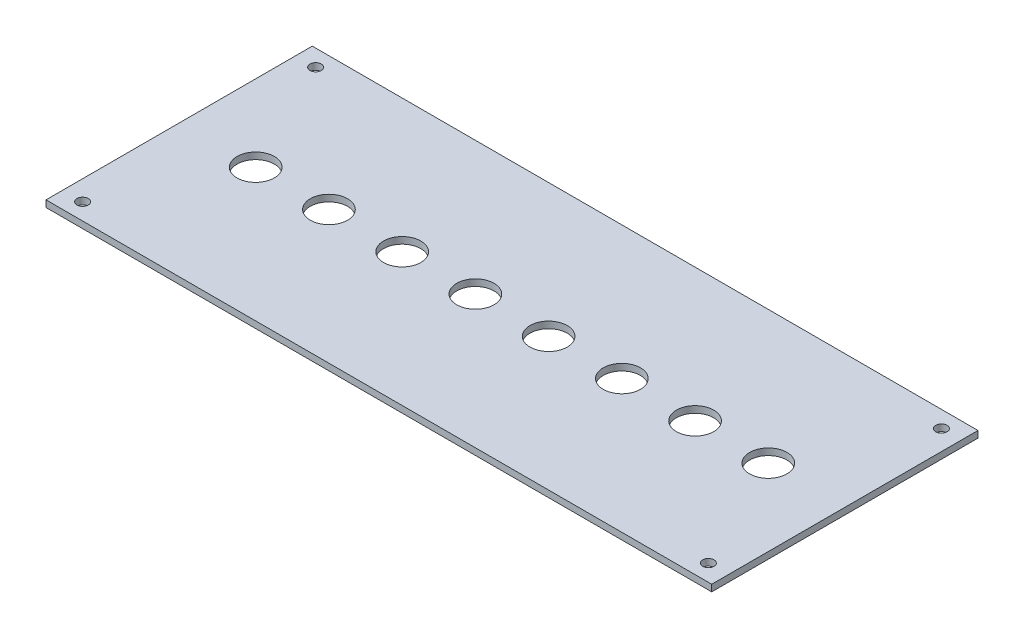
ISO-10303-21;
HEADER;
FILE_DESCRIPTION(('STEP AP214'),'2;1');
FILE_NAME('part.step','',(''),(''),'','','');
FILE_SCHEMA(('AUTOMOTIVE_DESIGN { 1 0 10303 214 1 1 1 1 }'));
ENDSEC;
DATA;
#1=APPLICATION_CONTEXT('core data for automotive mechanical design processes');
#2=APPLICATION_PROTOCOL_DEFINITION('international standard','automotive_design',2000,#1);
#3=PRODUCT_CONTEXT('',#1,'mechanical');
#4=PRODUCT('Part','Part','',(#3));
#5=PRODUCT_RELATED_PRODUCT_CATEGORY('part','',(#4));
#6=PRODUCT_DEFINITION_FORMATION('','',#4);
#7=PRODUCT_DEFINITION_CONTEXT('part definition',#1,'design');
#8=PRODUCT_DEFINITION('design','',#6,#7);
#9=PRODUCT_DEFINITION_SHAPE('','',#8);
#10=(LENGTH_UNIT() NAMED_UNIT(*) SI_UNIT(.MILLI.,.METRE.));
#11=(NAMED_UNIT(*) PLANE_ANGLE_UNIT() SI_UNIT($,.RADIAN.));
#12=(NAMED_UNIT(*) SI_UNIT($,.STERADIAN.) SOLID_ANGLE_UNIT());
#13=UNCERTAINTY_MEASURE_WITH_UNIT(LENGTH_MEASURE(1.E-05),#10,'distance_accuracy_value','');
#14=(GEOMETRIC_REPRESENTATION_CONTEXT(3) GLOBAL_UNCERTAINTY_ASSIGNED_CONTEXT((#13)) GLOBAL_UNIT_ASSIGNED_CONTEXT((#10,
#11,#12)) REPRESENTATION_CONTEXT('',''));
#15=CARTESIAN_POINT('',(0.,0.,0.));
#16=DIRECTION('',(0.,0.,1.));
#17=DIRECTION('',(1.,0.,0.));
#18=AXIS2_PLACEMENT_3D('',#15,#16,#17);
#19=CARTESIAN_POINT('',(0.,0.,80.));
#20=DIRECTION('',(0.,0.,1.));
#21=DIRECTION('',(1.,0.,0.));
#22=AXIS2_PLACEMENT_3D('',#19,#20,#21);
#23=PLANE('',#22);
#24=DIRECTION('',(-1.,0.,0.));
#25=VECTOR('',#24,1.);
#26=CARTESIAN_POINT('',(0.,-1.,80.));
#27=LINE('',#26,#25);
#28=CARTESIAN_POINT('',(100.,-1.,80.));
#29=VERTEX_POINT('',#28);
#30=CARTESIAN_POINT('',(-100.,-1.,80.));
#31=VERTEX_POINT('',#30);
#32=EDGE_CURVE('E11',#29,#31,#27,.T.);
#33=ORIENTED_EDGE('',*,*,#32,.F.);
#34=DIRECTION('',(0.,-1.,0.));
#35=VECTOR('',#34,1.);
#36=CARTESIAN_POINT('',(100.,0.,80.));
#37=LINE('',#36,#35);
#38=CARTESIAN_POINT('',(100.,1.,80.));
#39=VERTEX_POINT('',#38);
#40=EDGE_CURVE('E64',#39,#29,#37,.T.);
#41=ORIENTED_EDGE('',*,*,#40,.F.);
#42=DIRECTION('',(1.,0.,0.));
#43=VECTOR('',#42,1.);
#44=CARTESIAN_POINT('',(0.,1.,80.));
#45=LINE('',#44,#43);
#46=CARTESIAN_POINT('',(-100.,1.,80.));
#47=VERTEX_POINT('',#46);
#48=EDGE_CURVE('E104',#47,#39,#45,.T.);
#49=ORIENTED_EDGE('',*,*,#48,.F.);
#50=DIRECTION('',(0.,1.,0.));
#51=VECTOR('',#50,1.);
#52=CARTESIAN_POINT('',(-100.,0.,80.));
#53=LINE('',#52,#51);
#54=EDGE_CURVE('E26',#31,#47,#53,.T.);
#55=ORIENTED_EDGE('',*,*,#54,.F.);
#56=EDGE_LOOP('',(#33,#41,#49,#55));
#57=FACE_BOUND('',#56,.T.);
#58=ADVANCED_FACE('F17',(#57),#23,.T.);
#59=CARTESIAN_POINT('',(0.,-1.,0.));
#60=DIRECTION('',(0.,-1.,0.));
#61=DIRECTION('',(0.,0.,-1.));
#62=AXIS2_PLACEMENT_3D('',#59,#60,#61);
#63=PLANE('',#62);
#64=CARTESIAN_POINT('',(94.,-1.,75.));
#65=DIRECTION('',(0.,-1.,0.));
#66=DIRECTION('',(0.,0.,-1.));
#67=AXIS2_PLACEMENT_3D('',#64,#65,#66);
#68=CIRCLE('',#67,1.7);
#69=CARTESIAN_POINT('',(94.,-1.,73.3));
#70=VERTEX_POINT('',#69);
#71=EDGE_CURVE('E159',#70,#70,#68,.T.);
#72=ORIENTED_EDGE('',*,*,#71,.F.);
#73=EDGE_LOOP('',(#72));
#74=FACE_BOUND('',#73,.T.);
#75=CARTESIAN_POINT('',(94.,-1.,5.));
#76=DIRECTION('',(0.,-1.,0.));
#77=DIRECTION('',(0.,0.,-1.));
#78=AXIS2_PLACEMENT_3D('',#75,#76,#77);
#79=CIRCLE('',#78,1.7);
#80=CARTESIAN_POINT('',(94.,-1.,3.3));
#81=VERTEX_POINT('',#80);
#82=EDGE_CURVE('E156',#81,#81,#79,.T.);
#83=ORIENTED_EDGE('',*,*,#82,.F.);
#84=EDGE_LOOP('',(#83));
#85=FACE_BOUND('',#84,.T.);
#86=CARTESIAN_POINT('',(-94.,-1.,75.));
#87=DIRECTION('',(0.,-1.,0.));
#88=DIRECTION('',(0.,0.,-1.));
#89=AXIS2_PLACEMENT_3D('',#86,#87,#88);
#90=CIRCLE('',#89,1.7);
#91=CARTESIAN_POINT('',(-94.,-1.,73.3));
#92=VERTEX_POINT('',#91);
#93=EDGE_CURVE('E152',#92,#92,#90,.T.);
#94=ORIENTED_EDGE('',*,*,#93,.F.);
#95=EDGE_LOOP('',(#94));
#96=FACE_BOUND('',#95,.T.);
#97=CARTESIAN_POINT('',(-94.,-1.,5.));
#98=DIRECTION('',(0.,-1.,0.));
#99=DIRECTION('',(0.,0.,-1.));
#100=AXIS2_PLACEMENT_3D('',#97,#98,#99);
#101=CIRCLE('',#100,1.7);
#102=CARTESIAN_POINT('',(-94.,-1.,3.3));
#103=VERTEX_POINT('',#102);
#104=EDGE_CURVE('E147',#103,#103,#101,.T.);
#105=ORIENTED_EDGE('',*,*,#104,.F.);
#106=EDGE_LOOP('',(#105));
#107=FACE_BOUND('',#106,.T.);
#108=CARTESIAN_POINT('',(77.,-1.,40.));
#109=DIRECTION('',(0.,-1.,0.));
#110=DIRECTION('',(0.,0.,-1.));
#111=AXIS2_PLACEMENT_3D('',#108,#109,#110);
#112=CIRCLE('',#111,5.6);
#113=CARTESIAN_POINT('',(77.,-1.,34.4));
#114=VERTEX_POINT('',#113);
#115=EDGE_CURVE('E142',#114,#114,#112,.T.);
#116=ORIENTED_EDGE('',*,*,#115,.F.);
#117=EDGE_LOOP('',(#116));
#118=FACE_BOUND('',#117,.T.);
#119=CARTESIAN_POINT('',(55.,-1.,40.));
#120=DIRECTION('',(0.,-1.,0.));
#121=DIRECTION('',(0.,0.,-1.));
#122=AXIS2_PLACEMENT_3D('',#119,#120,#121);
#123=CIRCLE('',#122,5.6);
#124=CARTESIAN_POINT('',(55.,-1.,34.4));
#125=VERTEX_POINT('',#124);
#126=EDGE_CURVE('E137',#125,#125,#123,.T.);
#127=ORIENTED_EDGE('',*,*,#126,.F.);
#128=EDGE_LOOP('',(#127));
#129=FACE_BOUND('',#128,.T.);
#130=CARTESIAN_POINT('',(33.,-1.,40.));
#131=DIRECTION('',(0.,-1.,0.));
#132=DIRECTION('',(0.,0.,-1.));
#133=AXIS2_PLACEMENT_3D('',#130,#131,#132);
#134=CIRCLE('',#133,5.6);
#135=CARTESIAN_POINT('',(33.,-1.,34.4));
#136=VERTEX_POINT('',#135);
#137=EDGE_CURVE('E132',#136,#136,#134,.T.);
#138=ORIENTED_EDGE('',*,*,#137,.F.);
#139=EDGE_LOOP('',(#138));
#140=FACE_BOUND('',#139,.T.);
#141=CARTESIAN_POINT('',(11.,-1.,40.));
#142=DIRECTION('',(0.,-1.,0.));
#143=DIRECTION('',(0.,0.,-1.));
#144=AXIS2_PLACEMENT_3D('',#141,#142,#143);
#145=CIRCLE('',#144,5.6);
#146=CARTESIAN_POINT('',(11.,-1.,34.4));
#147=VERTEX_POINT('',#146);
#148=EDGE_CURVE('E128',#147,#147,#145,.T.);
#149=ORIENTED_EDGE('',*,*,#148,.F.);
#150=EDGE_LOOP('',(#149));
#151=FACE_BOUND('',#150,.T.);
#152=CARTESIAN_POINT('',(-11.,-1.,40.));
#153=DIRECTION('',(0.,-1.,0.));
#154=DIRECTION('',(0.,0.,-1.));
#155=AXIS2_PLACEMENT_3D('',#152,#153,#154);
#156=CIRCLE('',#155,5.6);
#157=CARTESIAN_POINT('',(-11.,-1.,34.4));
#158=VERTEX_POINT('',#157);
#159=EDGE_CURVE('E123',#158,#158,#156,.T.);
#160=ORIENTED_EDGE('',*,*,#159,.F.);
#161=EDGE_LOOP('',(#160));
#162=FACE_BOUND('',#161,.T.);
#163=CARTESIAN_POINT('',(-33.,-1.,40.));
#164=DIRECTION('',(0.,-1.,0.));
#165=DIRECTION('',(0.,0.,-1.));
#166=AXIS2_PLACEMENT_3D('',#163,#164,#165);
#167=CIRCLE('',#166,5.6);
#168=CARTESIAN_POINT('',(-33.,-1.,34.4));
#169=VERTEX_POINT('',#168);
#170=EDGE_CURVE('E118',#169,#169,#167,.T.);
#171=ORIENTED_EDGE('',*,*,#170,.F.);
#172=EDGE_LOOP('',(#171));
#173=FACE_BOUND('',#172,.T.);
#174=CARTESIAN_POINT('',(-55.,-1.,40.));
#175=DIRECTION('',(0.,-1.,0.));
#176=DIRECTION('',(0.,0.,-1.));
#177=AXIS2_PLACEMENT_3D('',#174,#175,#176);
#178=CIRCLE('',#177,5.6);
#179=CARTESIAN_POINT('',(-55.,-1.,34.4));
#180=VERTEX_POINT('',#179);
#181=EDGE_CURVE('E113',#180,#180,#178,.T.);
#182=ORIENTED_EDGE('',*,*,#181,.F.);
#183=EDGE_LOOP('',(#182));
#184=FACE_BOUND('',#183,.T.);
#185=CARTESIAN_POINT('',(-77.,-1.,40.));
#186=DIRECTION('',(0.,-1.,0.));
#187=DIRECTION('',(0.,0.,-1.));
#188=AXIS2_PLACEMENT_3D('',#185,#186,#187);
#189=CIRCLE('',#188,5.6);
#190=CARTESIAN_POINT('',(-77.,-1.,34.4));
#191=VERTEX_POINT('',#190);
#192=EDGE_CURVE('E77',#191,#191,#189,.T.);
#193=ORIENTED_EDGE('',*,*,#192,.F.);
#194=EDGE_LOOP('',(#193));
#195=FACE_BOUND('',#194,.T.);
#196=DIRECTION('',(0.,0.,1.));
#197=VECTOR('',#196,1.);
#198=CARTESIAN_POINT('',(100.,-1.,0.));
#199=LINE('',#198,#197);
#200=CARTESIAN_POINT('',(100.,-1.,0.));
#201=VERTEX_POINT('',#200);
#202=EDGE_CURVE('E57',#201,#29,#199,.T.);
#203=ORIENTED_EDGE('',*,*,#202,.T.);
#204=ORIENTED_EDGE('',*,*,#32,.T.);
#205=DIRECTION('',(0.,0.,1.));
#206=VECTOR('',#205,1.);
#207=CARTESIAN_POINT('',(-100.,-1.,0.));
#208=LINE('',#207,#206);
#209=CARTESIAN_POINT('',(-100.,-1.,0.));
#210=VERTEX_POINT('',#209);
#211=EDGE_CURVE('E71',#210,#31,#208,.T.);
#212=ORIENTED_EDGE('',*,*,#211,.F.);
#213=DIRECTION('',(1.,0.,0.));
#214=VECTOR('',#213,1.);
#215=CARTESIAN_POINT('',(0.,-1.,0.));
#216=LINE('',#215,#214);
#217=EDGE_CURVE('E69',#210,#201,#216,.T.);
#218=ORIENTED_EDGE('',*,*,#217,.T.);
#219=EDGE_LOOP('',(#203,#204,#212,#218));
#220=FACE_BOUND('',#219,.T.);
#221=ADVANCED_FACE('F70',(#74,#85,#96,#107,#118,#129,#140,#151,#162,#173,#184,#195,#220),#63,.T.);
#222=CARTESIAN_POINT('',(-100.,0.,0.));
#223=DIRECTION('',(-1.,0.,0.));
#224=DIRECTION('',(0.,0.,1.));
#225=AXIS2_PLACEMENT_3D('',#222,#223,#224);
#226=PLANE('',#225);
#227=ORIENTED_EDGE('',*,*,#211,.T.);
#228=ORIENTED_EDGE('',*,*,#54,.T.);
#229=DIRECTION('',(0.,0.,1.));
#230=VECTOR('',#229,1.);
#231=CARTESIAN_POINT('',(-100.,1.,0.));
#232=LINE('',#231,#230);
#233=CARTESIAN_POINT('',(-100.,1.,0.));
#234=VERTEX_POINT('',#233);
#235=EDGE_CURVE('E96',#234,#47,#232,.T.);
#236=ORIENTED_EDGE('',*,*,#235,.F.);
#237=DIRECTION('',(0.,-1.,0.));
#238=VECTOR('',#237,1.);
#239=CARTESIAN_POINT('',(-100.,0.,0.));
#240=LINE('',#239,#238);
#241=EDGE_CURVE('E76',#234,#210,#240,.T.);
#242=ORIENTED_EDGE('',*,*,#241,.T.);
#243=EDGE_LOOP('',(#227,#228,#236,#242));
#244=FACE_BOUND('',#243,.T.);
#245=ADVANCED_FACE('F207',(#244),#226,.T.);
#246=CARTESIAN_POINT('',(0.,1.,0.));
#247=DIRECTION('',(0.,1.,0.));
#248=DIRECTION('',(0.,0.,1.));
#249=AXIS2_PLACEMENT_3D('',#246,#247,#248);
#250=PLANE('',#249);
#251=CARTESIAN_POINT('',(94.,1.,75.));
#252=DIRECTION('',(0.,1.,0.));
#253=DIRECTION('',(0.,0.,1.));
#254=AXIS2_PLACEMENT_3D('',#251,#252,#253);
#255=CIRCLE('',#254,1.7);
#256=CARTESIAN_POINT('',(94.,1.,76.7));
#257=VERTEX_POINT('',#256);
#258=EDGE_CURVE('E20',#257,#257,#255,.T.);
#259=ORIENTED_EDGE('',*,*,#258,.F.);
#260=EDGE_LOOP('',(#259));
#261=FACE_BOUND('',#260,.T.);
#262=CARTESIAN_POINT('',(94.,1.,5.));
#263=DIRECTION('',(0.,1.,0.));
#264=DIRECTION('',(0.,0.,1.));
#265=AXIS2_PLACEMENT_3D('',#262,#263,#264);
#266=CIRCLE('',#265,1.7);
#267=CARTESIAN_POINT('',(94.,1.,6.7));
#268=VERTEX_POINT('',#267);
#269=EDGE_CURVE('E157',#268,#268,#266,.T.);
#270=ORIENTED_EDGE('',*,*,#269,.F.);
#271=EDGE_LOOP('',(#270));
#272=FACE_BOUND('',#271,.T.);
#273=CARTESIAN_POINT('',(-94.,1.,75.));
#274=DIRECTION('',(0.,1.,0.));
#275=DIRECTION('',(0.,0.,1.));
#276=AXIS2_PLACEMENT_3D('',#273,#274,#275);
#277=CIRCLE('',#276,1.7);
#278=CARTESIAN_POINT('',(-94.,1.,76.7));
#279=VERTEX_POINT('',#278);
#280=EDGE_CURVE('E153',#279,#279,#277,.T.);
#281=ORIENTED_EDGE('',*,*,#280,.F.);
#282=EDGE_LOOP('',(#281));
#283=FACE_BOUND('',#282,.T.);
#284=CARTESIAN_POINT('',(-94.,1.,5.));
#285=DIRECTION('',(0.,1.,0.));
#286=DIRECTION('',(0.,0.,1.));
#287=AXIS2_PLACEMENT_3D('',#284,#285,#286);
#288=CIRCLE('',#287,1.7);
#289=CARTESIAN_POINT('',(-94.,1.,6.7));
#290=VERTEX_POINT('',#289);
#291=EDGE_CURVE('E148',#290,#290,#288,.T.);
#292=ORIENTED_EDGE('',*,*,#291,.F.);
#293=EDGE_LOOP('',(#292));
#294=FACE_BOUND('',#293,.T.);
#295=CARTESIAN_POINT('',(77.,1.,40.));
#296=DIRECTION('',(0.,1.,0.));
#297=DIRECTION('',(0.,0.,1.));
#298=AXIS2_PLACEMENT_3D('',#295,#296,#297);
#299=CIRCLE('',#298,5.6);
#300=CARTESIAN_POINT('',(77.,1.,45.6));
#301=VERTEX_POINT('',#300);
#302=EDGE_CURVE('E143',#301,#301,#299,.T.);
#303=ORIENTED_EDGE('',*,*,#302,.F.);
#304=EDGE_LOOP('',(#303));
#305=FACE_BOUND('',#304,.T.);
#306=CARTESIAN_POINT('',(55.,1.,40.));
#307=DIRECTION('',(0.,1.,0.));
#308=DIRECTION('',(0.,0.,1.));
#309=AXIS2_PLACEMENT_3D('',#306,#307,#308);
#310=CIRCLE('',#309,5.6);
#311=CARTESIAN_POINT('',(55.,1.,45.6));
#312=VERTEX_POINT('',#311);
#313=EDGE_CURVE('E138',#312,#312,#310,.T.);
#314=ORIENTED_EDGE('',*,*,#313,.F.);
#315=EDGE_LOOP('',(#314));
#316=FACE_BOUND('',#315,.T.);
#317=CARTESIAN_POINT('',(33.,1.,40.));
#318=DIRECTION('',(0.,1.,0.));
#319=DIRECTION('',(0.,0.,1.));
#320=AXIS2_PLACEMENT_3D('',#317,#318,#319);
#321=CIRCLE('',#320,5.6);
#322=CARTESIAN_POINT('',(33.,1.,45.6));
#323=VERTEX_POINT('',#322);
#324=EDGE_CURVE('E133',#323,#323,#321,.T.);
#325=ORIENTED_EDGE('',*,*,#324,.F.);
#326=EDGE_LOOP('',(#325));
#327=FACE_BOUND('',#326,.T.);
#328=CARTESIAN_POINT('',(11.,1.,40.));
#329=DIRECTION('',(0.,1.,0.));
#330=DIRECTION('',(0.,0.,1.));
#331=AXIS2_PLACEMENT_3D('',#328,#329,#330);
#332=CIRCLE('',#331,5.6);
#333=CARTESIAN_POINT('',(11.,1.,45.6));
#334=VERTEX_POINT('',#333);
#335=EDGE_CURVE('E129',#334,#334,#332,.T.);
#336=ORIENTED_EDGE('',*,*,#335,.F.);
#337=EDGE_LOOP('',(#336));
#338=FACE_BOUND('',#337,.T.);
#339=CARTESIAN_POINT('',(-11.,1.,40.));
#340=DIRECTION('',(0.,1.,0.));
#341=DIRECTION('',(0.,0.,1.));
#342=AXIS2_PLACEMENT_3D('',#339,#340,#341);
#343=CIRCLE('',#342,5.6);
#344=CARTESIAN_POINT('',(-11.,1.,45.6));
#345=VERTEX_POINT('',#344);
#346=EDGE_CURVE('E124',#345,#345,#343,.T.);
#347=ORIENTED_EDGE('',*,*,#346,.F.);
#348=EDGE_LOOP('',(#347));
#349=FACE_BOUND('',#348,.T.);
#350=CARTESIAN_POINT('',(-33.,1.,40.));
#351=DIRECTION('',(0.,1.,0.));
#352=DIRECTION('',(0.,0.,1.));
#353=AXIS2_PLACEMENT_3D('',#350,#351,#352);
#354=CIRCLE('',#353,5.6);
#355=CARTESIAN_POINT('',(-33.,1.,45.6));
#356=VERTEX_POINT('',#355);
#357=EDGE_CURVE('E119',#356,#356,#354,.T.);
#358=ORIENTED_EDGE('',*,*,#357,.F.);
#359=EDGE_LOOP('',(#358));
#360=FACE_BOUND('',#359,.T.);
#361=CARTESIAN_POINT('',(-55.,1.,40.));
#362=DIRECTION('',(0.,1.,0.));
#363=DIRECTION('',(0.,0.,1.));
#364=AXIS2_PLACEMENT_3D('',#361,#362,#363);
#365=CIRCLE('',#364,5.6);
#366=CARTESIAN_POINT('',(-55.,1.,45.6));
#367=VERTEX_POINT('',#366);
#368=EDGE_CURVE('E114',#367,#367,#365,.T.);
#369=ORIENTED_EDGE('',*,*,#368,.F.);
#370=EDGE_LOOP('',(#369));
#371=FACE_BOUND('',#370,.T.);
#372=CARTESIAN_POINT('',(-77.,1.,40.));
#373=DIRECTION('',(0.,1.,0.));
#374=DIRECTION('',(0.,0.,1.));
#375=AXIS2_PLACEMENT_3D('',#372,#373,#374);
#376=CIRCLE('',#375,5.6);
#377=CARTESIAN_POINT('',(-77.,1.,45.6));
#378=VERTEX_POINT('',#377);
#379=EDGE_CURVE('E109',#378,#378,#376,.T.);
#380=ORIENTED_EDGE('',*,*,#379,.F.);
#381=EDGE_LOOP('',(#380));
#382=FACE_BOUND('',#381,.T.);
#383=ORIENTED_EDGE('',*,*,#235,.T.);
#384=ORIENTED_EDGE('',*,*,#48,.T.);
#385=DIRECTION('',(0.,0.,1.));
#386=VECTOR('',#385,1.);
#387=CARTESIAN_POINT('',(100.,1.,0.));
#388=LINE('',#387,#386);
#389=CARTESIAN_POINT('',(100.,1.,0.));
#390=VERTEX_POINT('',#389);
#391=EDGE_CURVE('E66',#390,#39,#388,.T.);
#392=ORIENTED_EDGE('',*,*,#391,.F.);
#393=DIRECTION('',(-1.,0.,0.));
#394=VECTOR('',#393,1.);
#395=CARTESIAN_POINT('',(0.,1.,0.));
#396=LINE('',#395,#394);
#397=EDGE_CURVE('E82',#390,#234,#396,.T.);
#398=ORIENTED_EDGE('',*,*,#397,.T.);
#399=EDGE_LOOP('',(#383,#384,#392,#398));
#400=FACE_BOUND('',#399,.T.);
#401=ADVANCED_FACE('F213',(#261,#272,#283,#294,#305,#316,#327,#338,#349,#360,#371,#382,#400),
#250,.T.);
#402=CARTESIAN_POINT('',(0.,0.,0.));
#403=DIRECTION('',(0.,0.,-1.));
#404=DIRECTION('',(-1.,0.,0.));
#405=AXIS2_PLACEMENT_3D('',#402,#403,#404);
#406=PLANE('',#405);
#407=DIRECTION('',(0.,1.,0.));
#408=VECTOR('',#407,1.);
#409=CARTESIAN_POINT('',(100.,0.,0.));
#410=LINE('',#409,#408);
#411=EDGE_CURVE('E62',#201,#390,#410,.T.);
#412=ORIENTED_EDGE('',*,*,#411,.F.);
#413=ORIENTED_EDGE('',*,*,#217,.F.);
#414=ORIENTED_EDGE('',*,*,#241,.F.);
#415=ORIENTED_EDGE('',*,*,#397,.F.);
#416=EDGE_LOOP('',(#412,#413,#414,#415));
#417=FACE_BOUND('',#416,.T.);
#418=ADVANCED_FACE('F80',(#417),#406,.T.);
#419=CARTESIAN_POINT('',(100.,0.,0.));
#420=DIRECTION('',(1.,0.,0.));
#421=DIRECTION('',(0.,0.,-1.));
#422=AXIS2_PLACEMENT_3D('',#419,#420,#421);
#423=PLANE('',#422);
#424=ORIENTED_EDGE('',*,*,#411,.T.);
#425=ORIENTED_EDGE('',*,*,#391,.T.);
#426=ORIENTED_EDGE('',*,*,#40,.T.);
#427=ORIENTED_EDGE('',*,*,#202,.F.);
#428=EDGE_LOOP('',(#424,#425,#426,#427));
#429=FACE_BOUND('',#428,.T.);
#430=ADVANCED_FACE('F59',(#429),#423,.T.);
#431=CARTESIAN_POINT('',(-77.,-1.3,40.));
#432=DIRECTION('',(0.,1.,0.));
#433=DIRECTION('',(0.,0.,1.));
#434=AXIS2_PLACEMENT_3D('',#431,#432,#433);
#435=CYLINDRICAL_SURFACE('',#434,5.6);
#436=ORIENTED_EDGE('',*,*,#192,.T.);
#437=EDGE_LOOP('',(#436));
#438=FACE_BOUND('',#437,.T.);
#439=ORIENTED_EDGE('',*,*,#379,.T.);
#440=EDGE_LOOP('',(#439));
#441=FACE_BOUND('',#440,.T.);
#442=ADVANCED_FACE('F203',(#438,#441),#435,.F.);
#443=CARTESIAN_POINT('',(-55.,-1.3,40.));
#444=DIRECTION('',(0.,1.,0.));
#445=DIRECTION('',(0.,0.,1.));
#446=AXIS2_PLACEMENT_3D('',#443,#444,#445);
#447=CYLINDRICAL_SURFACE('',#446,5.6);
#448=ORIENTED_EDGE('',*,*,#181,.T.);
#449=EDGE_LOOP('',(#448));
#450=FACE_BOUND('',#449,.T.);
#451=ORIENTED_EDGE('',*,*,#368,.T.);
#452=EDGE_LOOP('',(#451));
#453=FACE_BOUND('',#452,.T.);
#454=ADVANCED_FACE('F227',(#450,#453),#447,.F.);
#455=CARTESIAN_POINT('',(-33.,-1.3,40.));
#456=DIRECTION('',(0.,1.,0.));
#457=DIRECTION('',(0.,0.,1.));
#458=AXIS2_PLACEMENT_3D('',#455,#456,#457);
#459=CYLINDRICAL_SURFACE('',#458,5.6);
#460=ORIENTED_EDGE('',*,*,#170,.T.);
#461=EDGE_LOOP('',(#460));
#462=FACE_BOUND('',#461,.T.);
#463=ORIENTED_EDGE('',*,*,#357,.T.);
#464=EDGE_LOOP('',(#463));
#465=FACE_BOUND('',#464,.T.);
#466=ADVANCED_FACE('F230',(#462,#465),#459,.F.);
#467=CARTESIAN_POINT('',(-11.,-1.3,40.));
#468=DIRECTION('',(0.,1.,0.));
#469=DIRECTION('',(0.,0.,1.));
#470=AXIS2_PLACEMENT_3D('',#467,#468,#469);
#471=CYLINDRICAL_SURFACE('',#470,5.6);
#472=ORIENTED_EDGE('',*,*,#159,.T.);
#473=EDGE_LOOP('',(#472));
#474=FACE_BOUND('',#473,.T.);
#475=ORIENTED_EDGE('',*,*,#346,.T.);
#476=EDGE_LOOP('',(#475));
#477=FACE_BOUND('',#476,.T.);
#478=ADVANCED_FACE('F234',(#474,#477),#471,.F.);
#479=CARTESIAN_POINT('',(11.,-1.3,40.));
#480=DIRECTION('',(0.,1.,0.));
#481=DIRECTION('',(0.,0.,1.));
#482=AXIS2_PLACEMENT_3D('',#479,#480,#481);
#483=CYLINDRICAL_SURFACE('',#482,5.6);
#484=ORIENTED_EDGE('',*,*,#148,.T.);
#485=EDGE_LOOP('',(#484));
#486=FACE_BOUND('',#485,.T.);
#487=ORIENTED_EDGE('',*,*,#335,.T.);
#488=EDGE_LOOP('',(#487));
#489=FACE_BOUND('',#488,.T.);
#490=ADVANCED_FACE('F238',(#486,#489),#483,.F.);
#491=CARTESIAN_POINT('',(33.,-1.3,40.));
#492=DIRECTION('',(0.,1.,0.));
#493=DIRECTION('',(0.,0.,1.));
#494=AXIS2_PLACEMENT_3D('',#491,#492,#493);
#495=CYLINDRICAL_SURFACE('',#494,5.6);
#496=ORIENTED_EDGE('',*,*,#137,.T.);
#497=EDGE_LOOP('',(#496));
#498=FACE_BOUND('',#497,.T.);
#499=ORIENTED_EDGE('',*,*,#324,.T.);
#500=EDGE_LOOP('',(#499));
#501=FACE_BOUND('',#500,.T.);
#502=ADVANCED_FACE('F242',(#498,#501),#495,.F.);
#503=CARTESIAN_POINT('',(55.,-1.3,40.));
#504=DIRECTION('',(0.,1.,0.));
#505=DIRECTION('',(0.,0.,1.));
#506=AXIS2_PLACEMENT_3D('',#503,#504,#505);
#507=CYLINDRICAL_SURFACE('',#506,5.6);
#508=ORIENTED_EDGE('',*,*,#126,.T.);
#509=EDGE_LOOP('',(#508));
#510=FACE_BOUND('',#509,.T.);
#511=ORIENTED_EDGE('',*,*,#313,.T.);
#512=EDGE_LOOP('',(#511));
#513=FACE_BOUND('',#512,.T.);
#514=ADVANCED_FACE('F246',(#510,#513),#507,.F.);
#515=CARTESIAN_POINT('',(77.,-1.3,40.));
#516=DIRECTION('',(0.,1.,0.));
#517=DIRECTION('',(0.,0.,1.));
#518=AXIS2_PLACEMENT_3D('',#515,#516,#517);
#519=CYLINDRICAL_SURFACE('',#518,5.6);
#520=ORIENTED_EDGE('',*,*,#115,.T.);
#521=EDGE_LOOP('',(#520));
#522=FACE_BOUND('',#521,.T.);
#523=ORIENTED_EDGE('',*,*,#302,.T.);
#524=EDGE_LOOP('',(#523));
#525=FACE_BOUND('',#524,.T.);
#526=ADVANCED_FACE('F250',(#522,#525),#519,.F.);
#527=CARTESIAN_POINT('',(-94.,-1.3,5.));
#528=DIRECTION('',(0.,1.,0.));
#529=DIRECTION('',(0.,0.,1.));
#530=AXIS2_PLACEMENT_3D('',#527,#528,#529);
#531=CYLINDRICAL_SURFACE('',#530,1.7);
#532=ORIENTED_EDGE('',*,*,#104,.T.);
#533=EDGE_LOOP('',(#532));
#534=FACE_BOUND('',#533,.T.);
#535=ORIENTED_EDGE('',*,*,#291,.T.);
#536=EDGE_LOOP('',(#535));
#537=FACE_BOUND('',#536,.T.);
#538=ADVANCED_FACE('F254',(#534,#537),#531,.F.);
#539=CARTESIAN_POINT('',(-94.,-1.3,75.));
#540=DIRECTION('',(0.,1.,0.));
#541=DIRECTION('',(0.,0.,1.));
#542=AXIS2_PLACEMENT_3D('',#539,#540,#541);
#543=CYLINDRICAL_SURFACE('',#542,1.7);
#544=ORIENTED_EDGE('',*,*,#93,.T.);
#545=EDGE_LOOP('',(#544));
#546=FACE_BOUND('',#545,.T.);
#547=ORIENTED_EDGE('',*,*,#280,.T.);
#548=EDGE_LOOP('',(#547));
#549=FACE_BOUND('',#548,.T.);
#550=ADVANCED_FACE('F258',(#546,#549),#543,.F.);
#551=CARTESIAN_POINT('',(94.,-1.3,5.));
#552=DIRECTION('',(0.,1.,0.));
#553=DIRECTION('',(0.,0.,1.));
#554=AXIS2_PLACEMENT_3D('',#551,#552,#553);
#555=CYLINDRICAL_SURFACE('',#554,1.7);
#556=ORIENTED_EDGE('',*,*,#82,.T.);
#557=EDGE_LOOP('',(#556));
#558=FACE_BOUND('',#557,.T.);
#559=ORIENTED_EDGE('',*,*,#269,.T.);
#560=EDGE_LOOP('',(#559));
#561=FACE_BOUND('',#560,.T.);
#562=ADVANCED_FACE('F262',(#558,#561),#555,.F.);
#563=CARTESIAN_POINT('',(94.,-1.3,75.));
#564=DIRECTION('',(0.,1.,0.));
#565=DIRECTION('',(0.,0.,1.));
#566=AXIS2_PLACEMENT_3D('',#563,#564,#565);
#567=CYLINDRICAL_SURFACE('',#566,1.7);
#568=ORIENTED_EDGE('',*,*,#71,.T.);
#569=EDGE_LOOP('',(#568));
#570=FACE_BOUND('',#569,.T.);
#571=ORIENTED_EDGE('',*,*,#258,.T.);
#572=EDGE_LOOP('',(#571));
#573=FACE_BOUND('',#572,.T.);
#574=ADVANCED_FACE('F266',(#570,#573),#567,.F.);
#575=CLOSED_SHELL('',(#58,#221,#245,#401,#418,#430,#442,#454,#466,#478,#490,#502,#514,#526,#538,
#550,#562,#574));
#576=MANIFOLD_SOLID_BREP('B1',#575);
#577=ADVANCED_BREP_SHAPE_REPRESENTATION('',(#18,#576),#14);
#578=SHAPE_DEFINITION_REPRESENTATION(#9,#577);
ENDSEC;
END-ISO-10303-21;
